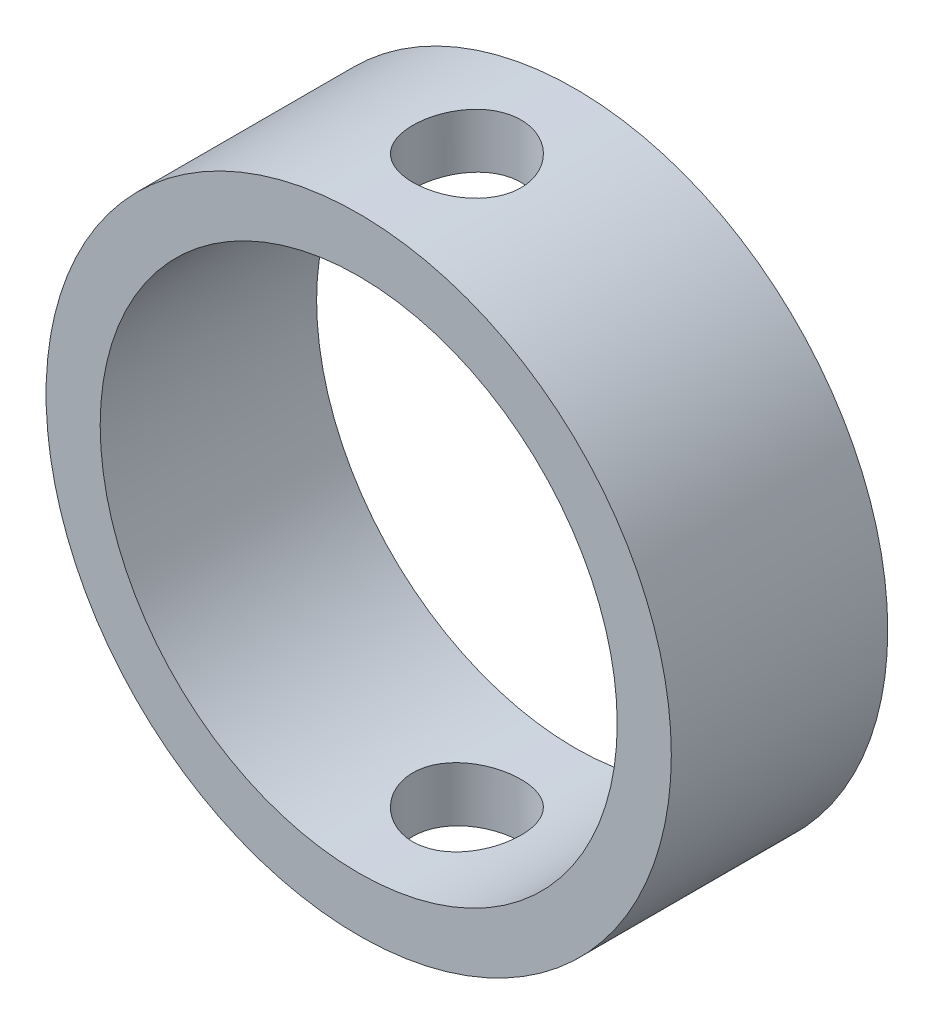
ISO-10303-21;
HEADER;
FILE_DESCRIPTION(('STEP AP214'),'2;1');
FILE_NAME('part.step','',(''),(''),'','','');
FILE_SCHEMA(('AUTOMOTIVE_DESIGN { 1 0 10303 214 1 1 1 1 }'));
ENDSEC;
DATA;
#1=APPLICATION_CONTEXT('core data for automotive mechanical design processes');
#2=APPLICATION_PROTOCOL_DEFINITION('international standard','automotive_design',2000,#1);
#3=PRODUCT_CONTEXT('',#1,'mechanical');
#4=PRODUCT('Part','Part','',(#3));
#5=PRODUCT_RELATED_PRODUCT_CATEGORY('part','',(#4));
#6=PRODUCT_DEFINITION_FORMATION('','',#4);
#7=PRODUCT_DEFINITION_CONTEXT('part definition',#1,'design');
#8=PRODUCT_DEFINITION('design','',#6,#7);
#9=PRODUCT_DEFINITION_SHAPE('','',#8);
#10=(LENGTH_UNIT() NAMED_UNIT(*) SI_UNIT(.MILLI.,.METRE.));
#11=(NAMED_UNIT(*) PLANE_ANGLE_UNIT() SI_UNIT($,.RADIAN.));
#12=(NAMED_UNIT(*) SI_UNIT($,.STERADIAN.) SOLID_ANGLE_UNIT());
#13=UNCERTAINTY_MEASURE_WITH_UNIT(LENGTH_MEASURE(1.E-05),#10,'distance_accuracy_value','');
#14=(GEOMETRIC_REPRESENTATION_CONTEXT(3) GLOBAL_UNCERTAINTY_ASSIGNED_CONTEXT((#13)) GLOBAL_UNIT_ASSIGNED_CONTEXT((#10,
#11,#12)) REPRESENTATION_CONTEXT('',''));
#15=CARTESIAN_POINT('',(0.,0.,0.));
#16=DIRECTION('',(0.,0.,1.));
#17=DIRECTION('',(1.,0.,0.));
#18=AXIS2_PLACEMENT_3D('',#15,#16,#17);
#19=CARTESIAN_POINT('',(0.,0.,-12.7));
#20=DIRECTION('',(0.,0.,1.));
#21=DIRECTION('',(1.,0.,0.));
#22=AXIS2_PLACEMENT_3D('',#19,#20,#21);
#23=CYLINDRICAL_SURFACE('',#22,36.688903);
#24=CARTESIAN_POINT('',(0.,-36.688903,6.35));
#25=CARTESIAN_POINT('',(-0.176985008051058,-36.6889042858993,6.35000286208098));
#26=CARTESIAN_POINT('',(-0.353931814969174,-36.6876200064123,6.34259847523221));
#27=CARTESIAN_POINT('',(-0.706607090069577,-36.6825215403633,6.31304284498367));
#28=CARTESIAN_POINT('',(-0.882335316766973,-36.6787068660597,6.29088875853062));
#29=CARTESIAN_POINT('',(-1.23136130261384,-36.6686495964065,6.23198178382681));
#30=CARTESIAN_POINT('',(-1.40465751108842,-36.6624055189698,6.19521998366925));
#31=CARTESIAN_POINT('',(-1.74754839954685,-36.6476620793776,6.10736502517855));
#32=CARTESIAN_POINT('',(-1.91714169625529,-36.6391618895076,6.05626660668391));
#33=CARTESIAN_POINT('',(-2.25116292202945,-36.6201559479828,5.94020106731335));
#34=CARTESIAN_POINT('',(-2.4155969193598,-36.6096526638429,5.87525099809278));
#35=CARTESIAN_POINT('',(-2.73843998245098,-36.5869204594593,5.73189781714801));
#36=CARTESIAN_POINT('',(-2.8968468012484,-36.574690903502,5.65348974709773));
#37=CARTESIAN_POINT('',(-3.20641433260841,-36.5488526164351,5.48384402445709));
#38=CARTESIAN_POINT('',(-3.35757853733252,-36.5352445600564,5.39261264006533));
#39=CARTESIAN_POINT('',(-3.65177834017248,-36.5070125897915,5.19789802602048));
#40=CARTESIAN_POINT('',(-3.79481088435374,-36.49238829877,5.09441023774273));
#41=CARTESIAN_POINT('',(-4.07295216152341,-36.4623971481586,4.87495820146436));
#42=CARTESIAN_POINT('',(-4.20797971895992,-36.4470248693236,4.75889179788073));
#43=CARTESIAN_POINT('',(-4.46785191428362,-36.4160821111817,4.51580202327719));
#44=CARTESIAN_POINT('',(-4.59269276304684,-36.4005115605912,4.38877461094116));
#45=CARTESIAN_POINT('',(-4.83124490757439,-36.3696183845946,4.12470874097489));
#46=CARTESIAN_POINT('',(-4.94495954533533,-36.3542956859023,3.98767331120031));
#47=CARTESIAN_POINT('',(-5.16055381291207,-36.3243188657431,3.70443951759995));
#48=CARTESIAN_POINT('',(-5.26242906235711,-36.3096649929404,3.55823779300633));
#49=CARTESIAN_POINT('',(-5.45418222122991,-36.2813582565682,3.2567635885485));
#50=CARTESIAN_POINT('',(-5.5439802514876,-36.2677123035128,3.10143962831416));
#51=CARTESIAN_POINT('',(-5.71018998173649,-36.2419150968526,2.78359668171065));
#52=CARTESIAN_POINT('',(-5.78659667732981,-36.2297644025354,2.62107503383657));
#53=CARTESIAN_POINT('',(-5.92538214171371,-36.2073253076883,2.29009103588521));
#54=CARTESIAN_POINT('',(-5.98776689697579,-36.1970361127846,2.12163125668248));
#55=CARTESIAN_POINT('',(-6.09809049021228,-36.1786121714384,1.77991347058591));
#56=CARTESIAN_POINT('',(-6.14602405976315,-36.1704782108535,1.60665373886252));
#57=CARTESIAN_POINT('',(-6.26666724615094,-36.1498473478631,1.08513511748949));
#58=CARTESIAN_POINT('',(-6.31775887612593,-36.140863703896,0.731450227161227));
#59=CARTESIAN_POINT('',(-6.35995365822439,-36.1334610475452,0.0206168375129681));
#60=CARTESIAN_POINT('',(-6.35106138871145,-36.1350412288612,-0.336531395384293));
#61=CARTESIAN_POINT('',(-6.2740985863235,-36.1484821359927,-1.0401867090678));
#62=CARTESIAN_POINT('',(-6.20668889916922,-36.160228054211,-1.38676803274594));
#63=CARTESIAN_POINT('',(-6.01562155877469,-36.1925019609785,-2.06361268144028));
#64=CARTESIAN_POINT('',(-5.89196183897006,-36.2130302721816,-2.39387540643483));
#65=CARTESIAN_POINT('',(-5.59124722502018,-36.2606775284809,-3.03069027867489));
#66=CARTESIAN_POINT('',(-5.41392008916746,-36.2878299365203,-3.33711127802754));
#67=CARTESIAN_POINT('',(-5.01109585176312,-36.3456434491084,-3.91609784868377));
#68=CARTESIAN_POINT('',(-4.78559456515044,-36.3763048583891,-4.18866047533369));
#69=CARTESIAN_POINT('',(-4.28923304859055,-36.4381849381417,-4.69601879112242));
#70=CARTESIAN_POINT('',(-4.01780616748829,-36.4694055748329,-4.93026022722777));
#71=CARTESIAN_POINT('',(-3.43920857456488,-36.5285077141894,-5.34996015644276));
#72=CARTESIAN_POINT('',(-3.13203759769871,-36.5563891920915,-5.53541828778747));
#73=CARTESIAN_POINT('',(-2.49013333077026,-36.6057158027554,-5.85234681942213));
#74=CARTESIAN_POINT('',(-2.15537409917473,-36.6271547875139,-5.98376569438499));
#75=CARTESIAN_POINT('',(-1.46808034866474,-36.6611320752536,-6.18835728680894));
#76=CARTESIAN_POINT('',(-1.11554743794514,-36.6736711819695,-6.26153526399101));
#77=CARTESIAN_POINT('',(-0.407488022176516,-36.6883271339157,-6.34681051840027));
#78=CARTESIAN_POINT('',(-0.0520556946196438,-36.6905737254001,-6.3596682357844));
#79=CARTESIAN_POINT('',(0.655883035542961,-36.6847477792906,-6.3259690183354));
#80=CARTESIAN_POINT('',(1.00838955926686,-36.6766756710211,-6.27941455543284));
#81=CARTESIAN_POINT('',(1.69810277660694,-36.6511997693644,-6.12884496752146));
#82=CARTESIAN_POINT('',(2.0353946662573,-36.633857538119,-6.02520878118955));
#83=CARTESIAN_POINT('',(2.68781645541602,-36.5917779327237,-5.76382326993454));
#84=CARTESIAN_POINT('',(3.00294502929686,-36.5670401166945,-5.60607071152568));
#85=CARTESIAN_POINT('',(3.60538097621755,-36.5125907737244,-5.23920653247368));
#86=CARTESIAN_POINT('',(3.89239680718969,-36.4828343890146,-5.02962295478357));
#87=CARTESIAN_POINT('',(4.42745615887106,-36.4217776740343,-4.56569082985058));
#88=CARTESIAN_POINT('',(4.67549660921078,-36.3904772223816,-4.31133875921624));
#89=CARTESIAN_POINT('',(5.12840450754481,-36.3294371462261,-3.76167421719205));
#90=CARTESIAN_POINT('',(5.33275659479937,-36.2997189622275,-3.46593438231837));
#91=CARTESIAN_POINT('',(5.68887899735889,-36.2456183266983,-2.84386346520973));
#92=CARTESIAN_POINT('',(5.84065107137917,-36.2212356967122,-2.51753340663163));
#93=CARTESIAN_POINT('',(6.08655203056825,-36.1807272542279,-1.84501493241036));
#94=CARTESIAN_POINT('',(6.1809313963321,-36.1645656139355,-1.49892012606598));
#95=CARTESIAN_POINT('',(6.31013005408873,-36.1422514725677,-0.795286465205625));
#96=CARTESIAN_POINT('',(6.34495497260975,-36.1360980259505,-0.437748695038801));
#97=CARTESIAN_POINT('',(6.35173467472131,-36.1348982689427,0.0963591419378621));
#98=CARTESIAN_POINT('',(6.34659093809253,-36.1358062580445,0.272919482423754));
#99=CARTESIAN_POINT('',(6.32163033773624,-36.1401827220077,0.624950079776698));
#100=CARTESIAN_POINT('',(6.3018189965182,-36.1436502331803,0.800420721859453));
#101=CARTESIAN_POINT('',(6.24765981368922,-36.1530509033216,1.14908732101336));
#102=CARTESIAN_POINT('',(6.21330679874864,-36.158984939765,1.32228244591836));
#103=CARTESIAN_POINT('',(6.13034567196745,-36.1731424799309,1.66506482049442));
#104=CARTESIAN_POINT('',(6.08174268277584,-36.1813651608668,1.83465334322768));
#105=CARTESIAN_POINT('',(5.97069790616176,-36.199855395542,2.16892953679334));
#106=CARTESIAN_POINT('',(5.90827013561858,-36.2101208770343,2.33362198125519));
#107=CARTESIAN_POINT('',(5.7700314699135,-36.2324058941225,2.65709656562951));
#108=CARTESIAN_POINT('',(5.69422535781922,-36.2444248025622,2.81588079338146));
#109=CARTESIAN_POINT('',(5.52972547833088,-36.2698864825882,3.12658734981866));
#110=CARTESIAN_POINT('',(5.4410266033791,-36.2833298178964,3.27850692761194));
#111=CARTESIAN_POINT('',(5.25141905065054,-36.3112568901723,3.57434692599576));
#112=CARTESIAN_POINT('',(5.15051464653519,-36.3257402622625,3.71827012084088));
#113=CARTESIAN_POINT('',(4.93575760103457,-36.3555470641048,3.99905567706525));
#114=CARTESIAN_POINT('',(4.82175204494173,-36.3708790403073,4.13580020183763));
#115=CARTESIAN_POINT('',(4.5827239660693,-36.4017685983398,4.39917671447096));
#116=CARTESIAN_POINT('',(4.4577053807856,-36.4173260978895,4.52581228597345));
#117=CARTESIAN_POINT('',(4.19739324053046,-36.4482465769591,4.76823246676857));
#118=CARTESIAN_POINT('',(4.06209361114407,-36.4636094351253,4.88401056940065));
#119=CARTESIAN_POINT('',(3.78225913640733,-36.4936968703595,5.10378848624897));
#120=CARTESIAN_POINT('',(3.63772771695154,-36.5084216808399,5.20779263048502));
#121=CARTESIAN_POINT('',(3.33919322675921,-36.5369408606663,5.40411464858582));
#122=CARTESIAN_POINT('',(3.18512432441484,-36.5507269563818,5.49633366222589));
#123=CARTESIAN_POINT('',(2.86969499467521,-36.5768436062441,5.66740957273768));
#124=CARTESIAN_POINT('',(2.70833727858019,-36.5891746955596,5.74627138722384));
#125=CARTESIAN_POINT('',(2.37952032233187,-36.6120282905287,5.89003838250498));
#126=CARTESIAN_POINT('',(2.2120653123271,-36.62255202216,5.95495303158711));
#127=CARTESIAN_POINT('',(1.87220737641163,-36.6414987119379,6.07038341273215));
#128=CARTESIAN_POINT('',(1.69980550142082,-36.6499221126512,6.12090217851398));
#129=CARTESIAN_POINT('',(1.27642846495253,-36.6675380597483,6.2256734613285));
#130=CARTESIAN_POINT('',(1.02345883527292,-36.675511766278,6.27223911335772));
#131=CARTESIAN_POINT('',(0.513632616453305,-36.6861932523858,6.33440000534458));
#132=CARTESIAN_POINT('',(0.256776103001881,-36.6889011343718,6.34999584759178));
#133=CARTESIAN_POINT('',(0.,-36.688903,6.35));
#134=B_SPLINE_CURVE_WITH_KNOTS('',3,(#24,#25,#26,#27,#28,#29,#30,#31,#32,#33,#34,#35,#36,#37,
#38,#39,#40,#41,#42,#43,#44,#45,#46,#47,#48,#49,#50,#51,#52,#53,#54,#55,#56,#57,#58,#59,#60,#61,
#62,#63,#64,#65,#66,#67,#68,#69,#70,#71,#72,#73,#74,#75,#76,#77,#78,#79,#80,#81,#82,#83,#84,#85,
#86,#87,#88,#89,#90,#91,#92,#93,#94,#95,#96,#97,#98,#99,#100,#101,#102,#103,#104,#105,#106,#107,
#108,#109,#110,#111,#112,#113,#114,#115,#116,#117,#118,#119,#120,#121,#122,#123,#124,#125,#126,
#127,#128,#129,#130,#131,#132,#133),.UNSPECIFIED.,.T.,.F.,(4,2,2,2,2,2,2,2,2,2,2,2,2,2,2,2,2,2,
2,2,2,2,2,2,2,2,2,2,2,2,2,2,2,2,2,2,2,2,2,2,2,2,2,2,2,2,2,2,2,2,2,2,2,2,4),(0.,
0.530729883660843,1.06156209688753,1.59271865987093,2.12407036170727,2.65477169630494,
3.18566897834736,3.71630764776283,4.24714430547492,4.78267110601647,5.31839620554836,
5.85395989132308,6.38972109986581,6.92886778849221,7.46821553087116,8.00733256702422,
8.54664591037735,9.61341762286224,10.6801079132729,11.7349063571688,12.7897435563307,
13.850024021497,14.9103966345098,15.9849602345399,17.0595318030434,18.135125590997,
19.2106222313174,20.2725232917263,21.3343801716306,22.3892713924146,23.4442256545644,
24.5091645349391,25.5741872661536,26.6511537449434,27.72808419749,28.8002801940172,
29.8723748870366,30.4017713532824,30.9309685974165,31.4603542666095,31.9895498625554,
32.5182113463589,33.0466842029063,33.5753669911527,34.1038651985975,34.6393179851934,
35.1745801020062,35.7101609676541,36.2455442224746,36.7851589244526,37.3245745268726,
37.8636227719743,38.4025573365031,39.1725739788772,39.9425756461018),.UNSPECIFIED.);
#135=CARTESIAN_POINT('',(0.,-36.688903,6.35));
#136=VERTEX_POINT('',#135);
#137=EDGE_CURVE('E79',#136,#136,#134,.T.);
#138=ORIENTED_EDGE('',*,*,#137,.F.);
#139=EDGE_LOOP('',(#138));
#140=FACE_BOUND('',#139,.T.);
#141=CARTESIAN_POINT('',(0.,36.688903,6.35));
#142=CARTESIAN_POINT('',(0.176985008051058,36.6889042858993,6.35000286208098));
#143=CARTESIAN_POINT('',(0.353931814969174,36.6876200064123,6.34259847523221));
#144=CARTESIAN_POINT('',(0.706607090069577,36.6825215403633,6.31304284498367));
#145=CARTESIAN_POINT('',(0.882335316766973,36.6787068660597,6.29088875853062));
#146=CARTESIAN_POINT('',(1.23136130261384,36.6686495964065,6.23198178382681));
#147=CARTESIAN_POINT('',(1.40465751108842,36.6624055189698,6.19521998366925));
#148=CARTESIAN_POINT('',(1.74754839954685,36.6476620793776,6.10736502517855));
#149=CARTESIAN_POINT('',(1.91714169625529,36.6391618895076,6.05626660668391));
#150=CARTESIAN_POINT('',(2.25116292202945,36.6201559479828,5.94020106731335));
#151=CARTESIAN_POINT('',(2.4155969193598,36.6096526638429,5.87525099809278));
#152=CARTESIAN_POINT('',(2.73843998245098,36.5869204594593,5.73189781714801));
#153=CARTESIAN_POINT('',(2.8968468012484,36.574690903502,5.65348974709773));
#154=CARTESIAN_POINT('',(3.20641433260841,36.5488526164351,5.48384402445709));
#155=CARTESIAN_POINT('',(3.35757853733252,36.5352445600564,5.39261264006533));
#156=CARTESIAN_POINT('',(3.65177834017248,36.5070125897915,5.19789802602048));
#157=CARTESIAN_POINT('',(3.79481088435374,36.49238829877,5.09441023774273));
#158=CARTESIAN_POINT('',(4.07295216152341,36.4623971481586,4.87495820146436));
#159=CARTESIAN_POINT('',(4.20797971895992,36.4470248693236,4.75889179788073));
#160=CARTESIAN_POINT('',(4.46785191428362,36.4160821111817,4.51580202327719));
#161=CARTESIAN_POINT('',(4.59269276304684,36.4005115605912,4.38877461094116));
#162=CARTESIAN_POINT('',(4.83124490757439,36.3696183845946,4.12470874097489));
#163=CARTESIAN_POINT('',(4.94495954533533,36.3542956859023,3.98767331120031));
#164=CARTESIAN_POINT('',(5.16055381291207,36.3243188657431,3.70443951759995));
#165=CARTESIAN_POINT('',(5.26242906235711,36.3096649929404,3.55823779300633));
#166=CARTESIAN_POINT('',(5.45418222122991,36.2813582565682,3.2567635885485));
#167=CARTESIAN_POINT('',(5.5439802514876,36.2677123035128,3.10143962831416));
#168=CARTESIAN_POINT('',(5.71018998173649,36.2419150968526,2.78359668171065));
#169=CARTESIAN_POINT('',(5.78659667732981,36.2297644025354,2.62107503383657));
#170=CARTESIAN_POINT('',(5.92538214171371,36.2073253076883,2.29009103588521));
#171=CARTESIAN_POINT('',(5.98776689697579,36.1970361127846,2.12163125668248));
#172=CARTESIAN_POINT('',(6.09809049021228,36.1786121714384,1.77991347058591));
#173=CARTESIAN_POINT('',(6.14602405976315,36.1704782108535,1.60665373886252));
#174=CARTESIAN_POINT('',(6.26666724615094,36.1498473478631,1.08513511748949));
#175=CARTESIAN_POINT('',(6.31775887612593,36.140863703896,0.731450227161227));
#176=CARTESIAN_POINT('',(6.35995365822439,36.1334610475452,0.0206168375129681));
#177=CARTESIAN_POINT('',(6.35106138871145,36.1350412288612,-0.336531395384293));
#178=CARTESIAN_POINT('',(6.2740985863235,36.1484821359927,-1.0401867090678));
#179=CARTESIAN_POINT('',(6.20668889916922,36.160228054211,-1.38676803274594));
#180=CARTESIAN_POINT('',(6.01562155877469,36.1925019609785,-2.06361268144028));
#181=CARTESIAN_POINT('',(5.89196183897006,36.2130302721816,-2.39387540643483));
#182=CARTESIAN_POINT('',(5.59124722502018,36.2606775284809,-3.03069027867489));
#183=CARTESIAN_POINT('',(5.41392008916746,36.2878299365203,-3.33711127802754));
#184=CARTESIAN_POINT('',(5.01109585176312,36.3456434491084,-3.91609784868377));
#185=CARTESIAN_POINT('',(4.78559456515044,36.3763048583891,-4.18866047533369));
#186=CARTESIAN_POINT('',(4.28923304859055,36.4381849381417,-4.69601879112242));
#187=CARTESIAN_POINT('',(4.01780616748829,36.4694055748329,-4.93026022722777));
#188=CARTESIAN_POINT('',(3.43920857456488,36.5285077141894,-5.34996015644276));
#189=CARTESIAN_POINT('',(3.13203759769871,36.5563891920915,-5.53541828778747));
#190=CARTESIAN_POINT('',(2.49013333077026,36.6057158027554,-5.85234681942213));
#191=CARTESIAN_POINT('',(2.15537409917473,36.6271547875139,-5.98376569438499));
#192=CARTESIAN_POINT('',(1.46808034866474,36.6611320752536,-6.18835728680894));
#193=CARTESIAN_POINT('',(1.11554743794514,36.6736711819695,-6.26153526399101));
#194=CARTESIAN_POINT('',(0.407488022176516,36.6883271339157,-6.34681051840027));
#195=CARTESIAN_POINT('',(0.0520556946196438,36.6905737254001,-6.3596682357844));
#196=CARTESIAN_POINT('',(-0.655883035542961,36.6847477792906,-6.3259690183354));
#197=CARTESIAN_POINT('',(-1.00838955926686,36.6766756710211,-6.27941455543284));
#198=CARTESIAN_POINT('',(-1.69810277660694,36.6511997693644,-6.12884496752146));
#199=CARTESIAN_POINT('',(-2.0353946662573,36.633857538119,-6.02520878118955));
#200=CARTESIAN_POINT('',(-2.68781645541602,36.5917779327237,-5.76382326993454));
#201=CARTESIAN_POINT('',(-3.00294502929686,36.5670401166945,-5.60607071152568));
#202=CARTESIAN_POINT('',(-3.60538097621755,36.5125907737244,-5.23920653247368));
#203=CARTESIAN_POINT('',(-3.89239680718969,36.4828343890146,-5.02962295478357));
#204=CARTESIAN_POINT('',(-4.42745615887106,36.4217776740343,-4.56569082985058));
#205=CARTESIAN_POINT('',(-4.67549660921078,36.3904772223816,-4.31133875921624));
#206=CARTESIAN_POINT('',(-5.12840450754481,36.3294371462261,-3.76167421719205));
#207=CARTESIAN_POINT('',(-5.33275659479937,36.2997189622275,-3.46593438231837));
#208=CARTESIAN_POINT('',(-5.68887899735889,36.2456183266983,-2.84386346520973));
#209=CARTESIAN_POINT('',(-5.84065107137917,36.2212356967122,-2.51753340663163));
#210=CARTESIAN_POINT('',(-6.08655203056825,36.1807272542279,-1.84501493241036));
#211=CARTESIAN_POINT('',(-6.1809313963321,36.1645656139355,-1.49892012606598));
#212=CARTESIAN_POINT('',(-6.31013005408873,36.1422514725677,-0.795286465205625));
#213=CARTESIAN_POINT('',(-6.34495497260975,36.1360980259505,-0.437748695038801));
#214=CARTESIAN_POINT('',(-6.35173467472131,36.1348982689427,0.0963591419378621));
#215=CARTESIAN_POINT('',(-6.34659093809253,36.1358062580445,0.272919482423754));
#216=CARTESIAN_POINT('',(-6.32163033773624,36.1401827220077,0.624950079776698));
#217=CARTESIAN_POINT('',(-6.3018189965182,36.1436502331803,0.800420721859453));
#218=CARTESIAN_POINT('',(-6.24765981368922,36.1530509033216,1.14908732101336));
#219=CARTESIAN_POINT('',(-6.21330679874864,36.158984939765,1.32228244591836));
#220=CARTESIAN_POINT('',(-6.13034567196745,36.1731424799309,1.66506482049442));
#221=CARTESIAN_POINT('',(-6.08174268277584,36.1813651608668,1.83465334322768));
#222=CARTESIAN_POINT('',(-5.97069790616176,36.199855395542,2.16892953679334));
#223=CARTESIAN_POINT('',(-5.90827013561858,36.2101208770343,2.33362198125519));
#224=CARTESIAN_POINT('',(-5.7700314699135,36.2324058941225,2.65709656562951));
#225=CARTESIAN_POINT('',(-5.69422535781922,36.2444248025622,2.81588079338146));
#226=CARTESIAN_POINT('',(-5.52972547833088,36.2698864825882,3.12658734981866));
#227=CARTESIAN_POINT('',(-5.4410266033791,36.2833298178964,3.27850692761194));
#228=CARTESIAN_POINT('',(-5.25141905065054,36.3112568901723,3.57434692599576));
#229=CARTESIAN_POINT('',(-5.15051464653519,36.3257402622625,3.71827012084088));
#230=CARTESIAN_POINT('',(-4.93575760103457,36.3555470641048,3.99905567706525));
#231=CARTESIAN_POINT('',(-4.82175204494173,36.3708790403073,4.13580020183763));
#232=CARTESIAN_POINT('',(-4.5827239660693,36.4017685983398,4.39917671447096));
#233=CARTESIAN_POINT('',(-4.4577053807856,36.4173260978895,4.52581228597345));
#234=CARTESIAN_POINT('',(-4.19739324053046,36.4482465769591,4.76823246676857));
#235=CARTESIAN_POINT('',(-4.06209361114407,36.4636094351253,4.88401056940065));
#236=CARTESIAN_POINT('',(-3.78225913640733,36.4936968703595,5.10378848624897));
#237=CARTESIAN_POINT('',(-3.63772771695154,36.5084216808399,5.20779263048502));
#238=CARTESIAN_POINT('',(-3.33919322675921,36.5369408606663,5.40411464858582));
#239=CARTESIAN_POINT('',(-3.18512432441484,36.5507269563818,5.49633366222589));
#240=CARTESIAN_POINT('',(-2.86969499467521,36.5768436062441,5.66740957273768));
#241=CARTESIAN_POINT('',(-2.70833727858019,36.5891746955596,5.74627138722384));
#242=CARTESIAN_POINT('',(-2.37952032233187,36.6120282905287,5.89003838250498));
#243=CARTESIAN_POINT('',(-2.2120653123271,36.62255202216,5.95495303158711));
#244=CARTESIAN_POINT('',(-1.87220737641163,36.6414987119379,6.07038341273215));
#245=CARTESIAN_POINT('',(-1.69980550142082,36.6499221126512,6.12090217851398));
#246=CARTESIAN_POINT('',(-1.27642846495253,36.6675380597483,6.2256734613285));
#247=CARTESIAN_POINT('',(-1.02345883527292,36.675511766278,6.27223911335772));
#248=CARTESIAN_POINT('',(-0.513632616453305,36.6861932523858,6.33440000534458));
#249=CARTESIAN_POINT('',(-0.256776103001881,36.6889011343718,6.34999584759178));
#250=CARTESIAN_POINT('',(0.,36.688903,6.35));
#251=B_SPLINE_CURVE_WITH_KNOTS('',3,(#141,#142,#143,#144,#145,#146,#147,#148,#149,#150,#151,
#152,#153,#154,#155,#156,#157,#158,#159,#160,#161,#162,#163,#164,#165,#166,#167,#168,#169,#170,
#171,#172,#173,#174,#175,#176,#177,#178,#179,#180,#181,#182,#183,#184,#185,#186,#187,#188,#189,
#190,#191,#192,#193,#194,#195,#196,#197,#198,#199,#200,#201,#202,#203,#204,#205,#206,#207,#208,
#209,#210,#211,#212,#213,#214,#215,#216,#217,#218,#219,#220,#221,#222,#223,#224,#225,#226,#227,
#228,#229,#230,#231,#232,#233,#234,#235,#236,#237,#238,#239,#240,#241,#242,#243,#244,#245,#246,
#247,#248,#249,#250),.UNSPECIFIED.,.T.,.F.,(4,2,2,2,2,2,2,2,2,2,2,2,2,2,2,2,2,2,2,2,2,2,2,2,2,2,
2,2,2,2,2,2,2,2,2,2,2,2,2,2,2,2,2,2,2,2,2,2,2,2,2,2,2,2,4),(0.,0.530729883660843,
1.06156209688753,1.59271865987093,2.12407036170727,2.65477169630494,3.18566897834736,
3.71630764776283,4.24714430547492,4.78267110601647,5.31839620554836,5.85395989132308,
6.38972109986581,6.92886778849221,7.46821553087116,8.00733256702422,8.54664591037735,
9.61341762286224,10.6801079132729,11.7349063571688,12.7897435563307,13.850024021497,
14.9103966345098,15.9849602345399,17.0595318030434,18.135125590997,19.2106222313174,
20.2725232917263,21.3343801716306,22.3892713924146,23.4442256545644,24.5091645349391,
25.5741872661536,26.6511537449434,27.72808419749,28.8002801940172,29.8723748870366,
30.4017713532824,30.9309685974165,31.4603542666095,31.9895498625554,32.5182113463589,
33.0466842029063,33.5753669911527,34.1038651985975,34.6393179851934,35.1745801020062,
35.7101609676541,36.2455442224746,36.7851589244526,37.3245745268726,37.8636227719743,
38.4025573365031,39.1725739788772,39.9425756461018),.UNSPECIFIED.);
#252=CARTESIAN_POINT('',(0.,36.688903,6.35));
#253=VERTEX_POINT('',#252);
#254=EDGE_CURVE('E75',#253,#253,#251,.T.);
#255=ORIENTED_EDGE('',*,*,#254,.F.);
#256=EDGE_LOOP('',(#255));
#257=FACE_BOUND('',#256,.T.);
#258=CARTESIAN_POINT('',(0.,0.,-12.7));
#259=DIRECTION('',(0.,0.,1.));
#260=DIRECTION('',(1.,0.,0.));
#261=AXIS2_PLACEMENT_3D('',#258,#259,#260);
#262=CIRCLE('',#261,36.688903);
#263=CARTESIAN_POINT('',(36.688903,0.,-12.7));
#264=VERTEX_POINT('',#263);
#265=EDGE_CURVE('E10',#264,#264,#262,.T.);
#266=ORIENTED_EDGE('',*,*,#265,.T.);
#267=EDGE_LOOP('',(#266));
#268=FACE_BOUND('',#267,.T.);
#269=CARTESIAN_POINT('',(0.,0.,12.7));
#270=DIRECTION('',(0.,0.,1.));
#271=DIRECTION('',(1.,0.,0.));
#272=AXIS2_PLACEMENT_3D('',#269,#270,#271);
#273=CIRCLE('',#272,36.688903);
#274=CARTESIAN_POINT('',(36.688903,0.,12.7));
#275=VERTEX_POINT('',#274);
#276=EDGE_CURVE('E54',#275,#275,#273,.T.);
#277=ORIENTED_EDGE('',*,*,#276,.F.);
#278=EDGE_LOOP('',(#277));
#279=FACE_BOUND('',#278,.T.);
#280=ADVANCED_FACE('F37',(#140,#257,#268,#279),#23,.T.);
#281=CARTESIAN_POINT('',(0.,0.,-12.7));
#282=DIRECTION('',(0.,0.,1.));
#283=DIRECTION('',(1.,0.,0.));
#284=AXIS2_PLACEMENT_3D('',#281,#282,#283);
#285=PLANE('',#284);
#286=CARTESIAN_POINT('',(0.,0.,-12.7));
#287=DIRECTION('',(0.,0.,1.));
#288=DIRECTION('',(1.,0.,0.));
#289=AXIS2_PLACEMENT_3D('',#286,#287,#288);
#290=CIRCLE('',#289,30.338903);
#291=CARTESIAN_POINT('',(30.338903,0.,-12.7));
#292=VERTEX_POINT('',#291);
#293=EDGE_CURVE('E49',#292,#292,#290,.T.);
#294=ORIENTED_EDGE('',*,*,#293,.T.);
#295=EDGE_LOOP('',(#294));
#296=FACE_BOUND('',#295,.T.);
#297=ORIENTED_EDGE('',*,*,#265,.F.);
#298=EDGE_LOOP('',(#297));
#299=FACE_BOUND('',#298,.T.);
#300=ADVANCED_FACE('F92',(#296,#299),#285,.F.);
#301=CARTESIAN_POINT('',(0.,0.,-12.7));
#302=DIRECTION('',(0.,0.,1.));
#303=DIRECTION('',(1.,0.,0.));
#304=AXIS2_PLACEMENT_3D('',#301,#302,#303);
#305=CYLINDRICAL_SURFACE('',#304,30.338903);
#306=CARTESIAN_POINT('',(0.,-30.338903,6.35));
#307=CARTESIAN_POINT('',(-0.176338948393121,-30.338904994268,6.35000378306462));
#308=CARTESIAN_POINT('',(-0.352631617816241,-30.3373629967394,6.34265285739828));
#309=CARTESIAN_POINT('',(-0.703994224655794,-30.3312424165301,6.3133157670636));
#310=CARTESIAN_POINT('',(-0.879063962414662,-30.3266633492046,6.2913272665812));
#311=CARTESIAN_POINT('',(-1.22674631930877,-30.3145907941658,6.23287183246272));
#312=CARTESIAN_POINT('',(-1.39935771386976,-30.307095903242,6.19639792769684));
#313=CARTESIAN_POINT('',(-1.74088268085906,-30.2893976524091,6.10924672286926));
#314=CARTESIAN_POINT('',(-1.90979486886042,-30.2791932966199,6.05856419996103));
#315=CARTESIAN_POINT('',(-2.24244279614672,-30.2563752840743,5.94347406146843));
#316=CARTESIAN_POINT('',(-2.40618538812629,-30.2437649875662,5.8790855739287));
#317=CARTESIAN_POINT('',(-2.72768099389287,-30.2164662140395,5.73699879112376));
#318=CARTESIAN_POINT('',(-2.88543177224074,-30.2017769708771,5.65929558681843));
#319=CARTESIAN_POINT('',(-3.19375594153407,-30.1707301637477,5.49119663308415));
#320=CARTESIAN_POINT('',(-3.34433240282825,-30.1543733230354,5.40080637980913));
#321=CARTESIAN_POINT('',(-3.63744349476852,-30.120421959042,5.20790727079974));
#322=CARTESIAN_POINT('',(-3.77997509010228,-30.1028269741628,5.10539388558964));
#323=CARTESIAN_POINT('',(-4.05778338626722,-30.0666477312967,4.88758100411674));
#324=CARTESIAN_POINT('',(-4.19294315510399,-30.0480536580515,4.7721339742587));
#325=CARTESIAN_POINT('',(-4.45314207387028,-30.0105956040996,4.53029636507015));
#326=CARTESIAN_POINT('',(-4.57817745400247,-29.9917315259058,4.40390174535045));
#327=CARTESIAN_POINT('',(-4.8171978602849,-29.954269706333,4.14109226907266));
#328=CARTESIAN_POINT('',(-4.93118600398657,-29.9356718910841,4.00468025865414));
#329=CARTESIAN_POINT('',(-5.14741285115208,-29.899250905701,3.72266373020111));
#330=CARTESIAN_POINT('',(-5.249647205162,-29.8814280238358,3.57705583994247));
#331=CARTESIAN_POINT('',(-5.4425331654338,-29.8469021126933,3.2762121268949));
#332=CARTESIAN_POINT('',(-5.53306283503443,-29.830211619136,3.12089663107146));
#333=CARTESIAN_POINT('',(-5.70072723947489,-29.7986245387131,2.80295014045052));
#334=CARTESIAN_POINT('',(-5.77785694223046,-29.7837286264068,2.64031642618582));
#335=CARTESIAN_POINT('',(-5.91805924202139,-29.7561881166194,2.30898096260875));
#336=CARTESIAN_POINT('',(-5.98113823892297,-29.7435424946979,2.14028201674405));
#337=CARTESIAN_POINT('',(-6.092803026506,-29.7208677290488,1.79798440110323));
#338=CARTESIAN_POINT('',(-6.14138357019828,-29.7108395327316,1.62438398230302));
#339=CARTESIAN_POINT('',(-6.26348871918517,-29.6854345224834,1.10312165889198));
#340=CARTESIAN_POINT('',(-6.31555421562247,-29.674293969,0.749832617208003));
#341=CARTESIAN_POINT('',(-6.34877784805386,-29.66718698342,0.217568382977115));
#342=CARTESIAN_POINT('',(-6.35236571534283,-29.6664202505773,0.0396867112952603));
#343=CARTESIAN_POINT('',(-6.34463329696231,-29.668075256317,-0.315759311894041));
#344=CARTESIAN_POINT('',(-6.33331279657221,-29.6704970408226,-0.493323658794273));
#345=CARTESIAN_POINT('',(-6.27764946618538,-29.6823497306183,-1.01759614355721));
#346=CARTESIAN_POINT('',(-6.21198220951922,-29.6962891718127,-1.36217860735256));
#347=CARTESIAN_POINT('',(-6.02518249190549,-29.7347459971496,-2.03514388101053));
#348=CARTESIAN_POINT('',(-5.90404715591747,-29.7592639295963,-2.36352585018613));
#349=CARTESIAN_POINT('',(-5.60882881693827,-29.8163168707113,-2.9977885875709));
#350=CARTESIAN_POINT('',(-5.43436332853849,-29.8489094600322,-3.30348630452525));
#351=CARTESIAN_POINT('',(-5.03770747082985,-29.9184049699762,-3.88161864863301));
#352=CARTESIAN_POINT('',(-4.81551111834503,-29.9553084307125,-4.15404909893519));
#353=CARTESIAN_POINT('',(-4.32448643932621,-30.030161507744,-4.66357481329138));
#354=CARTESIAN_POINT('',(-4.05482381529542,-30.0681173911023,-4.89986595898491));
#355=CARTESIAN_POINT('',(-3.47927894459139,-30.140133178126,-5.32399317558818));
#356=CARTESIAN_POINT('',(-3.17339614474766,-30.1741930222737,-5.51182850632005));
#357=CARTESIAN_POINT('',(-2.53315763979692,-30.2346754056912,-5.83388629018195));
#358=CARTESIAN_POINT('',(-2.19875099656126,-30.2610838951816,-5.96801028639333));
#359=CARTESIAN_POINT('',(-1.51147352263092,-30.3031825913308,-6.17794517325687));
#360=CARTESIAN_POINT('',(-1.15860515254768,-30.318874222453,-6.25376381391022));
#361=CARTESIAN_POINT('',(-0.451325400186687,-30.3375706706081,-6.3437822302564));
#362=CARTESIAN_POINT('',(-0.0970597685281053,-30.3408018489709,-6.35908155666395));
#363=CARTESIAN_POINT('',(0.608965328326119,-30.3348447785965,-6.33059742665261));
#364=CARTESIAN_POINT('',(0.960724947126029,-30.325657297752,-6.28681762331969));
#365=CARTESIAN_POINT('',(1.64815887855628,-30.2960374658784,-6.14233105814251));
#366=CARTESIAN_POINT('',(1.98395834001978,-30.275717816734,-6.04219457762386));
#367=CARTESIAN_POINT('',(2.63399800178827,-30.2261054635235,-5.78846386681435));
#368=CARTESIAN_POINT('',(2.94823647331707,-30.1968120409604,-5.63486535588053));
#369=CARTESIAN_POINT('',(3.55082616297077,-30.1319401798971,-5.27623937711044));
#370=CARTESIAN_POINT('',(3.83877943294459,-30.0962836442252,-5.0705577552011));
#371=CARTESIAN_POINT('',(4.37648195643535,-30.0228116695134,-4.61445542515322));
#372=CARTESIAN_POINT('',(4.6262266883372,-29.9849959756838,-4.3640294295362));
#373=CARTESIAN_POINT('',(5.08469943667065,-29.9106973045828,-3.82058728971365));
#374=CARTESIAN_POINT('',(5.29266909368823,-29.8742473263445,-3.5269271480176));
#375=CARTESIAN_POINT('',(5.65638293259057,-29.8075287932411,-2.90799785110141));
#376=CARTESIAN_POINT('',(5.81212929785597,-29.777259979971,-2.58273001808688));
#377=CARTESIAN_POINT('',(6.00256807551983,-29.7392379073731,-2.0793749300728));
#378=CARTESIAN_POINT('',(6.05877373412082,-29.7278112918387,-1.90940802414359));
#379=CARTESIAN_POINT('',(6.15667071284901,-29.7076920535456,-1.56520231444664));
#380=CARTESIAN_POINT('',(6.19836738711063,-29.6989984223703,-1.39096511197405));
#381=CARTESIAN_POINT('',(6.26690399885808,-29.6846116922662,-1.03946885685872));
#382=CARTESIAN_POINT('',(6.29374283914923,-29.6789188149332,-0.862209582043468));
#383=CARTESIAN_POINT('',(6.33234292907244,-29.6707071244869,-0.505985643089404));
#384=CARTESIAN_POINT('',(6.34410476295632,-29.6681881883795,-0.327021045304637));
#385=CARTESIAN_POINT('',(6.35236804062369,-29.6664199203391,0.0277035318590925));
#386=CARTESIAN_POINT('',(6.34916891199684,-29.6671064343261,0.203456304324845));
#387=CARTESIAN_POINT('',(6.32821978835551,-29.6715820978954,0.554049959828421));
#388=CARTESIAN_POINT('',(6.31047007654742,-29.6753711870905,0.728890860547876));
#389=CARTESIAN_POINT('',(6.26055931481515,-29.6859408015653,1.07644014583781));
#390=CARTESIAN_POINT('',(6.22839585818591,-29.6927218264143,1.2491481693249));
#391=CARTESIAN_POINT('',(6.14992702559886,-29.7090732943119,1.5911198793684));
#392=CARTESIAN_POINT('',(6.10362668254171,-29.7186427445923,1.76038476888412));
#393=CARTESIAN_POINT('',(5.99737680514897,-29.7402662228703,2.09392642658239));
#394=CARTESIAN_POINT('',(5.93746279152896,-29.7523137773955,2.25821493671461));
#395=CARTESIAN_POINT('',(5.80439114398702,-29.7785606251907,2.58108936869436));
#396=CARTESIAN_POINT('',(5.73123817890412,-29.792759159611,2.73967727735444));
#397=CARTESIAN_POINT('',(5.57216935193715,-29.8229193092562,3.05022584770984));
#398=CARTESIAN_POINT('',(5.48624811024595,-29.8388816669229,3.20218368079613));
#399=CARTESIAN_POINT('',(5.30229809477454,-29.8721174183486,3.49835889312708));
#400=CARTESIAN_POINT('',(5.20427344475197,-29.8893903648074,3.64257888484234));
#401=CARTESIAN_POINT('',(4.994789490625,-29.9251167386841,3.92505787235594));
#402=CARTESIAN_POINT('',(4.88311094396877,-29.9435863257057,4.06315228587571));
#403=CARTESIAN_POINT('',(4.6486533161554,-29.9808795548455,4.32943194621223));
#404=CARTESIAN_POINT('',(4.52587812713668,-29.9997030710029,4.45762063841383));
#405=CARTESIAN_POINT('',(4.26994225624274,-30.0371996202573,4.70335877394421));
#406=CARTESIAN_POINT('',(4.13677547657661,-30.0558725577961,4.8209018817023));
#407=CARTESIAN_POINT('',(3.86105971255225,-30.0925336826641,5.04442286163143));
#408=CARTESIAN_POINT('',(3.71851419405845,-30.1105221191114,5.1504049680538));
#409=CARTESIAN_POINT('',(3.42317324581903,-30.1455352072301,5.35132370169977));
#410=CARTESIAN_POINT('',(3.27027487501157,-30.1625456071492,5.44611158725341));
#411=CARTESIAN_POINT('',(2.95691062409146,-30.1948756576621,5.62240957695275));
#412=CARTESIAN_POINT('',(2.79644756007336,-30.2101959304523,5.70392457261993));
#413=CARTESIAN_POINT('',(2.46911087915031,-30.2387084060842,5.85306008362064));
#414=CARTESIAN_POINT('',(2.30224102210671,-30.2519018341373,5.92068860472615));
#415=CARTESIAN_POINT('',(1.96325684699537,-30.2757915705473,6.04156569463969));
#416=CARTESIAN_POINT('',(1.79114350956894,-30.2864883426296,6.09481693415212));
#417=CARTESIAN_POINT('',(1.3537402452581,-30.309829078887,6.20998444141842));
#418=CARTESIAN_POINT('',(1.08579391147764,-30.3206733400427,6.26241554469562));
#419=CARTESIAN_POINT('',(0.545194750638752,-30.3352086250348,6.33241974540194));
#420=CARTESIAN_POINT('',(0.272542100873876,-30.3388999177429,6.34999415305361));
#421=CARTESIAN_POINT('',(0.,-30.338903,6.35));
#422=B_SPLINE_CURVE_WITH_KNOTS('',3,(#306,#307,#308,#309,#310,#311,#312,#313,#314,#315,#316,
#317,#318,#319,#320,#321,#322,#323,#324,#325,#326,#327,#328,#329,#330,#331,#332,#333,#334,#335,
#336,#337,#338,#339,#340,#341,#342,#343,#344,#345,#346,#347,#348,#349,#350,#351,#352,#353,#354,
#355,#356,#357,#358,#359,#360,#361,#362,#363,#364,#365,#366,#367,#368,#369,#370,#371,#372,#373,
#374,#375,#376,#377,#378,#379,#380,#381,#382,#383,#384,#385,#386,#387,#388,#389,#390,#391,#392,
#393,#394,#395,#396,#397,#398,#399,#400,#401,#402,#403,#404,#405,#406,#407,#408,#409,#410,#411,
#412,#413,#414,#415,#416,#417,#418,#419,#420,#421),.UNSPECIFIED.,.T.,.F.,(4,2,2,2,2,2,2,2,2,2,2,
2,2,2,2,2,2,2,2,2,2,2,2,2,2,2,2,2,2,2,2,2,2,2,2,2,2,2,2,2,2,2,2,2,2,2,2,2,2,2,2,2,2,2,2,2,2,4),
(0.,0.528777390722844,1.05763918216453,1.58675579841983,2.1160671645437,2.64464461097072,
3.17341736107031,3.70196174461585,4.23070423190796,4.76624936043369,5.30199298988788,
5.83758498851382,6.37337454770552,6.91435987449897,7.45554792022108,7.99648895729686,
8.53762552416122,9.60323810629309,10.1364723207122,10.6697142152223,11.7175255459324,
12.7653911933062,13.8209558698554,14.8766529412099,15.9531996525161,17.0297628074396,
18.1082904483926,19.186674705674,20.2453737084819,21.3040072509271,22.3521161121712,
23.4003089135925,24.4623833317769,25.5245833392537,26.604602304255,27.6845761095865,
28.222185183484,28.7595956568852,29.2970458107196,29.8344751370961,30.3611949549495,
30.8879045211952,31.4147020664618,31.9413122837476,32.4665639373548,32.9916307157791,
33.5169193573028,34.0420295188104,34.577082779963,35.1119490945629,35.6471316638916,
36.1821175581869,36.7235600535896,37.2648025547517,37.805732139497,38.3465611726515,
39.163848105929,39.9811043177611),.UNSPECIFIED.);
#423=CARTESIAN_POINT('',(0.,-30.338903,6.35));
#424=VERTEX_POINT('',#423);
#425=EDGE_CURVE('E41',#424,#424,#422,.T.);
#426=ORIENTED_EDGE('',*,*,#425,.T.);
#427=EDGE_LOOP('',(#426));
#428=FACE_BOUND('',#427,.T.);
#429=CARTESIAN_POINT('',(0.,30.338903,6.35));
#430=CARTESIAN_POINT('',(0.176338948393121,30.338904994268,6.35000378306462));
#431=CARTESIAN_POINT('',(0.352631617816241,30.3373629967394,6.34265285739828));
#432=CARTESIAN_POINT('',(0.703994224655794,30.3312424165301,6.3133157670636));
#433=CARTESIAN_POINT('',(0.879063962414662,30.3266633492046,6.2913272665812));
#434=CARTESIAN_POINT('',(1.22674631930877,30.3145907941658,6.23287183246272));
#435=CARTESIAN_POINT('',(1.39935771386976,30.307095903242,6.19639792769684));
#436=CARTESIAN_POINT('',(1.74088268085906,30.2893976524091,6.10924672286926));
#437=CARTESIAN_POINT('',(1.90979486886042,30.2791932966199,6.05856419996103));
#438=CARTESIAN_POINT('',(2.24244279614672,30.2563752840743,5.94347406146843));
#439=CARTESIAN_POINT('',(2.40618538812629,30.2437649875662,5.8790855739287));
#440=CARTESIAN_POINT('',(2.72768099389287,30.2164662140395,5.73699879112376));
#441=CARTESIAN_POINT('',(2.88543177224074,30.2017769708771,5.65929558681843));
#442=CARTESIAN_POINT('',(3.19375594153407,30.1707301637477,5.49119663308415));
#443=CARTESIAN_POINT('',(3.34433240282825,30.1543733230354,5.40080637980913));
#444=CARTESIAN_POINT('',(3.63744349476852,30.120421959042,5.20790727079974));
#445=CARTESIAN_POINT('',(3.77997509010228,30.1028269741628,5.10539388558964));
#446=CARTESIAN_POINT('',(4.05778338626722,30.0666477312967,4.88758100411674));
#447=CARTESIAN_POINT('',(4.19294315510399,30.0480536580515,4.7721339742587));
#448=CARTESIAN_POINT('',(4.45314207387028,30.0105956040996,4.53029636507015));
#449=CARTESIAN_POINT('',(4.57817745400247,29.9917315259058,4.40390174535045));
#450=CARTESIAN_POINT('',(4.8171978602849,29.954269706333,4.14109226907266));
#451=CARTESIAN_POINT('',(4.93118600398657,29.9356718910841,4.00468025865414));
#452=CARTESIAN_POINT('',(5.14741285115208,29.899250905701,3.72266373020111));
#453=CARTESIAN_POINT('',(5.249647205162,29.8814280238358,3.57705583994247));
#454=CARTESIAN_POINT('',(5.4425331654338,29.8469021126933,3.2762121268949));
#455=CARTESIAN_POINT('',(5.53306283503443,29.830211619136,3.12089663107146));
#456=CARTESIAN_POINT('',(5.70072723947489,29.7986245387131,2.80295014045052));
#457=CARTESIAN_POINT('',(5.77785694223046,29.7837286264068,2.64031642618582));
#458=CARTESIAN_POINT('',(5.91805924202139,29.7561881166194,2.30898096260875));
#459=CARTESIAN_POINT('',(5.98113823892297,29.7435424946979,2.14028201674405));
#460=CARTESIAN_POINT('',(6.092803026506,29.7208677290488,1.79798440110323));
#461=CARTESIAN_POINT('',(6.14138357019828,29.7108395327316,1.62438398230302));
#462=CARTESIAN_POINT('',(6.26348871918517,29.6854345224834,1.10312165889198));
#463=CARTESIAN_POINT('',(6.31555421562247,29.674293969,0.749832617208003));
#464=CARTESIAN_POINT('',(6.34877784805386,29.66718698342,0.217568382977115));
#465=CARTESIAN_POINT('',(6.35236571534283,29.6664202505773,0.0396867112952603));
#466=CARTESIAN_POINT('',(6.34463329696231,29.668075256317,-0.315759311894041));
#467=CARTESIAN_POINT('',(6.33331279657221,29.6704970408226,-0.493323658794273));
#468=CARTESIAN_POINT('',(6.27764946618538,29.6823497306183,-1.01759614355721));
#469=CARTESIAN_POINT('',(6.21198220951922,29.6962891718127,-1.36217860735256));
#470=CARTESIAN_POINT('',(6.02518249190549,29.7347459971496,-2.03514388101053));
#471=CARTESIAN_POINT('',(5.90404715591747,29.7592639295963,-2.36352585018613));
#472=CARTESIAN_POINT('',(5.60882881693827,29.8163168707113,-2.9977885875709));
#473=CARTESIAN_POINT('',(5.43436332853849,29.8489094600322,-3.30348630452525));
#474=CARTESIAN_POINT('',(5.03770747082985,29.9184049699762,-3.88161864863301));
#475=CARTESIAN_POINT('',(4.81551111834503,29.9553084307125,-4.15404909893519));
#476=CARTESIAN_POINT('',(4.32448643932621,30.030161507744,-4.66357481329138));
#477=CARTESIAN_POINT('',(4.05482381529542,30.0681173911023,-4.89986595898491));
#478=CARTESIAN_POINT('',(3.47927894459139,30.140133178126,-5.32399317558818));
#479=CARTESIAN_POINT('',(3.17339614474766,30.1741930222737,-5.51182850632005));
#480=CARTESIAN_POINT('',(2.53315763979692,30.2346754056912,-5.83388629018195));
#481=CARTESIAN_POINT('',(2.19875099656126,30.2610838951816,-5.96801028639333));
#482=CARTESIAN_POINT('',(1.51147352263092,30.3031825913308,-6.17794517325687));
#483=CARTESIAN_POINT('',(1.15860515254768,30.318874222453,-6.25376381391022));
#484=CARTESIAN_POINT('',(0.451325400186687,30.3375706706081,-6.3437822302564));
#485=CARTESIAN_POINT('',(0.0970597685281053,30.3408018489709,-6.35908155666395));
#486=CARTESIAN_POINT('',(-0.608965328326119,30.3348447785965,-6.33059742665261));
#487=CARTESIAN_POINT('',(-0.960724947126029,30.325657297752,-6.28681762331969));
#488=CARTESIAN_POINT('',(-1.64815887855628,30.2960374658784,-6.14233105814251));
#489=CARTESIAN_POINT('',(-1.98395834001978,30.275717816734,-6.04219457762386));
#490=CARTESIAN_POINT('',(-2.63399800178827,30.2261054635235,-5.78846386681435));
#491=CARTESIAN_POINT('',(-2.94823647331707,30.1968120409604,-5.63486535588053));
#492=CARTESIAN_POINT('',(-3.55082616297077,30.1319401798971,-5.27623937711044));
#493=CARTESIAN_POINT('',(-3.83877943294459,30.0962836442252,-5.0705577552011));
#494=CARTESIAN_POINT('',(-4.37648195643535,30.0228116695134,-4.61445542515322));
#495=CARTESIAN_POINT('',(-4.6262266883372,29.9849959756838,-4.3640294295362));
#496=CARTESIAN_POINT('',(-5.08469943667065,29.9106973045828,-3.82058728971365));
#497=CARTESIAN_POINT('',(-5.29266909368823,29.8742473263445,-3.5269271480176));
#498=CARTESIAN_POINT('',(-5.65638293259057,29.8075287932411,-2.90799785110141));
#499=CARTESIAN_POINT('',(-5.81212929785597,29.777259979971,-2.58273001808688));
#500=CARTESIAN_POINT('',(-6.00256807551983,29.7392379073731,-2.0793749300728));
#501=CARTESIAN_POINT('',(-6.05877373412082,29.7278112918387,-1.90940802414359));
#502=CARTESIAN_POINT('',(-6.15667071284901,29.7076920535456,-1.56520231444664));
#503=CARTESIAN_POINT('',(-6.19836738711063,29.6989984223703,-1.39096511197405));
#504=CARTESIAN_POINT('',(-6.26690399885808,29.6846116922662,-1.03946885685872));
#505=CARTESIAN_POINT('',(-6.29374283914923,29.6789188149332,-0.862209582043468));
#506=CARTESIAN_POINT('',(-6.33234292907244,29.6707071244869,-0.505985643089404));
#507=CARTESIAN_POINT('',(-6.34410476295632,29.6681881883795,-0.327021045304637));
#508=CARTESIAN_POINT('',(-6.35236804062369,29.6664199203391,0.0277035318590925));
#509=CARTESIAN_POINT('',(-6.34916891199684,29.6671064343261,0.203456304324845));
#510=CARTESIAN_POINT('',(-6.32821978835551,29.6715820978954,0.554049959828421));
#511=CARTESIAN_POINT('',(-6.31047007654742,29.6753711870905,0.728890860547876));
#512=CARTESIAN_POINT('',(-6.26055931481515,29.6859408015653,1.07644014583781));
#513=CARTESIAN_POINT('',(-6.22839585818591,29.6927218264143,1.2491481693249));
#514=CARTESIAN_POINT('',(-6.14992702559886,29.7090732943119,1.5911198793684));
#515=CARTESIAN_POINT('',(-6.10362668254171,29.7186427445923,1.76038476888412));
#516=CARTESIAN_POINT('',(-5.99737680514897,29.7402662228703,2.09392642658239));
#517=CARTESIAN_POINT('',(-5.93746279152896,29.7523137773955,2.25821493671461));
#518=CARTESIAN_POINT('',(-5.80439114398702,29.7785606251907,2.58108936869436));
#519=CARTESIAN_POINT('',(-5.73123817890412,29.792759159611,2.73967727735444));
#520=CARTESIAN_POINT('',(-5.57216935193715,29.8229193092562,3.05022584770984));
#521=CARTESIAN_POINT('',(-5.48624811024595,29.8388816669229,3.20218368079613));
#522=CARTESIAN_POINT('',(-5.30229809477454,29.8721174183486,3.49835889312708));
#523=CARTESIAN_POINT('',(-5.20427344475197,29.8893903648074,3.64257888484234));
#524=CARTESIAN_POINT('',(-4.994789490625,29.9251167386841,3.92505787235594));
#525=CARTESIAN_POINT('',(-4.88311094396877,29.9435863257057,4.06315228587571));
#526=CARTESIAN_POINT('',(-4.6486533161554,29.9808795548455,4.32943194621223));
#527=CARTESIAN_POINT('',(-4.52587812713668,29.9997030710029,4.45762063841383));
#528=CARTESIAN_POINT('',(-4.26994225624274,30.0371996202573,4.70335877394421));
#529=CARTESIAN_POINT('',(-4.13677547657661,30.0558725577961,4.8209018817023));
#530=CARTESIAN_POINT('',(-3.86105971255225,30.0925336826641,5.04442286163143));
#531=CARTESIAN_POINT('',(-3.71851419405845,30.1105221191114,5.1504049680538));
#532=CARTESIAN_POINT('',(-3.42317324581903,30.1455352072301,5.35132370169977));
#533=CARTESIAN_POINT('',(-3.27027487501157,30.1625456071492,5.44611158725341));
#534=CARTESIAN_POINT('',(-2.95691062409146,30.1948756576621,5.62240957695275));
#535=CARTESIAN_POINT('',(-2.79644756007336,30.2101959304523,5.70392457261993));
#536=CARTESIAN_POINT('',(-2.46911087915031,30.2387084060842,5.85306008362064));
#537=CARTESIAN_POINT('',(-2.30224102210671,30.2519018341373,5.92068860472615));
#538=CARTESIAN_POINT('',(-1.96325684699537,30.2757915705473,6.04156569463969));
#539=CARTESIAN_POINT('',(-1.79114350956894,30.2864883426296,6.09481693415212));
#540=CARTESIAN_POINT('',(-1.3537402452581,30.309829078887,6.20998444141842));
#541=CARTESIAN_POINT('',(-1.08579391147764,30.3206733400427,6.26241554469562));
#542=CARTESIAN_POINT('',(-0.545194750638752,30.3352086250348,6.33241974540194));
#543=CARTESIAN_POINT('',(-0.272542100873876,30.3388999177429,6.34999415305361));
#544=CARTESIAN_POINT('',(0.,30.338903,6.35));
#545=B_SPLINE_CURVE_WITH_KNOTS('',3,(#429,#430,#431,#432,#433,#434,#435,#436,#437,#438,#439,
#440,#441,#442,#443,#444,#445,#446,#447,#448,#449,#450,#451,#452,#453,#454,#455,#456,#457,#458,
#459,#460,#461,#462,#463,#464,#465,#466,#467,#468,#469,#470,#471,#472,#473,#474,#475,#476,#477,
#478,#479,#480,#481,#482,#483,#484,#485,#486,#487,#488,#489,#490,#491,#492,#493,#494,#495,#496,
#497,#498,#499,#500,#501,#502,#503,#504,#505,#506,#507,#508,#509,#510,#511,#512,#513,#514,#515,
#516,#517,#518,#519,#520,#521,#522,#523,#524,#525,#526,#527,#528,#529,#530,#531,#532,#533,#534,
#535,#536,#537,#538,#539,#540,#541,#542,#543,#544),.UNSPECIFIED.,.T.,.F.,(4,2,2,2,2,2,2,2,2,2,2,
2,2,2,2,2,2,2,2,2,2,2,2,2,2,2,2,2,2,2,2,2,2,2,2,2,2,2,2,2,2,2,2,2,2,2,2,2,2,2,2,2,2,2,2,2,2,4),
(0.,0.528777390722844,1.05763918216453,1.58675579841983,2.1160671645437,2.64464461097072,
3.17341736107031,3.70196174461585,4.23070423190796,4.76624936043369,5.30199298988788,
5.83758498851382,6.37337454770552,6.91435987449897,7.45554792022108,7.99648895729686,
8.53762552416122,9.60323810629309,10.1364723207122,10.6697142152223,11.7175255459324,
12.7653911933062,13.8209558698554,14.8766529412099,15.9531996525161,17.0297628074396,
18.1082904483926,19.186674705674,20.2453737084819,21.3040072509271,22.3521161121712,
23.4003089135925,24.4623833317769,25.5245833392537,26.604602304255,27.6845761095865,
28.222185183484,28.7595956568852,29.2970458107196,29.8344751370961,30.3611949549495,
30.8879045211952,31.4147020664618,31.9413122837476,32.4665639373548,32.9916307157791,
33.5169193573028,34.0420295188104,34.577082779963,35.1119490945629,35.6471316638916,
36.1821175581869,36.7235600535896,37.2648025547517,37.805732139497,38.3465611726515,
39.163848105929,39.9811043177611),.UNSPECIFIED.);
#546=CARTESIAN_POINT('',(0.,30.338903,6.35));
#547=VERTEX_POINT('',#546);
#548=EDGE_CURVE('E57',#547,#547,#545,.T.);
#549=ORIENTED_EDGE('',*,*,#548,.T.);
#550=EDGE_LOOP('',(#549));
#551=FACE_BOUND('',#550,.T.);
#552=ORIENTED_EDGE('',*,*,#293,.F.);
#553=EDGE_LOOP('',(#552));
#554=FACE_BOUND('',#553,.T.);
#555=CARTESIAN_POINT('',(0.,0.,12.7));
#556=DIRECTION('',(0.,0.,1.));
#557=DIRECTION('',(1.,0.,0.));
#558=AXIS2_PLACEMENT_3D('',#555,#556,#557);
#559=CIRCLE('',#558,30.338903);
#560=CARTESIAN_POINT('',(30.338903,0.,12.7));
#561=VERTEX_POINT('',#560);
#562=EDGE_CURVE('E84',#561,#561,#559,.T.);
#563=ORIENTED_EDGE('',*,*,#562,.T.);
#564=EDGE_LOOP('',(#563));
#565=FACE_BOUND('',#564,.T.);
#566=ADVANCED_FACE('F61',(#428,#551,#554,#565),#305,.F.);
#567=CARTESIAN_POINT('',(0.,0.,12.7));
#568=DIRECTION('',(0.,0.,1.));
#569=DIRECTION('',(1.,0.,0.));
#570=AXIS2_PLACEMENT_3D('',#567,#568,#569);
#571=PLANE('',#570);
#572=ORIENTED_EDGE('',*,*,#276,.T.);
#573=EDGE_LOOP('',(#572));
#574=FACE_BOUND('',#573,.T.);
#575=ORIENTED_EDGE('',*,*,#562,.F.);
#576=EDGE_LOOP('',(#575));
#577=FACE_BOUND('',#576,.T.);
#578=ADVANCED_FACE('F69',(#574,#577),#571,.T.);
#579=CARTESIAN_POINT('',(0.,-36.688903,0.));
#580=DIRECTION('',(0.,1.,0.));
#581=DIRECTION('',(0.,0.,1.));
#582=AXIS2_PLACEMENT_3D('',#579,#580,#581);
#583=CYLINDRICAL_SURFACE('',#582,6.35);
#584=ORIENTED_EDGE('',*,*,#254,.T.);
#585=EDGE_LOOP('',(#584));
#586=FACE_BOUND('',#585,.T.);
#587=ORIENTED_EDGE('',*,*,#548,.F.);
#588=EDGE_LOOP('',(#587));
#589=FACE_BOUND('',#588,.T.);
#590=ADVANCED_FACE('F67',(#586,#589),#583,.F.);
#591=ORIENTED_EDGE('',*,*,#137,.T.);
#592=EDGE_LOOP('',(#591));
#593=FACE_BOUND('',#592,.T.);
#594=ORIENTED_EDGE('',*,*,#425,.F.);
#595=EDGE_LOOP('',(#594));
#596=FACE_BOUND('',#595,.T.);
#597=ADVANCED_FACE('F64',(#593,#596),#583,.F.);
#598=CLOSED_SHELL('',(#280,#300,#566,#578,#590,#597));
#599=MANIFOLD_SOLID_BREP('B2',#598);
#600=ADVANCED_BREP_SHAPE_REPRESENTATION('',(#18,#599),#14);
#601=SHAPE_DEFINITION_REPRESENTATION(#9,#600);
ENDSEC;
END-ISO-10303-21;
